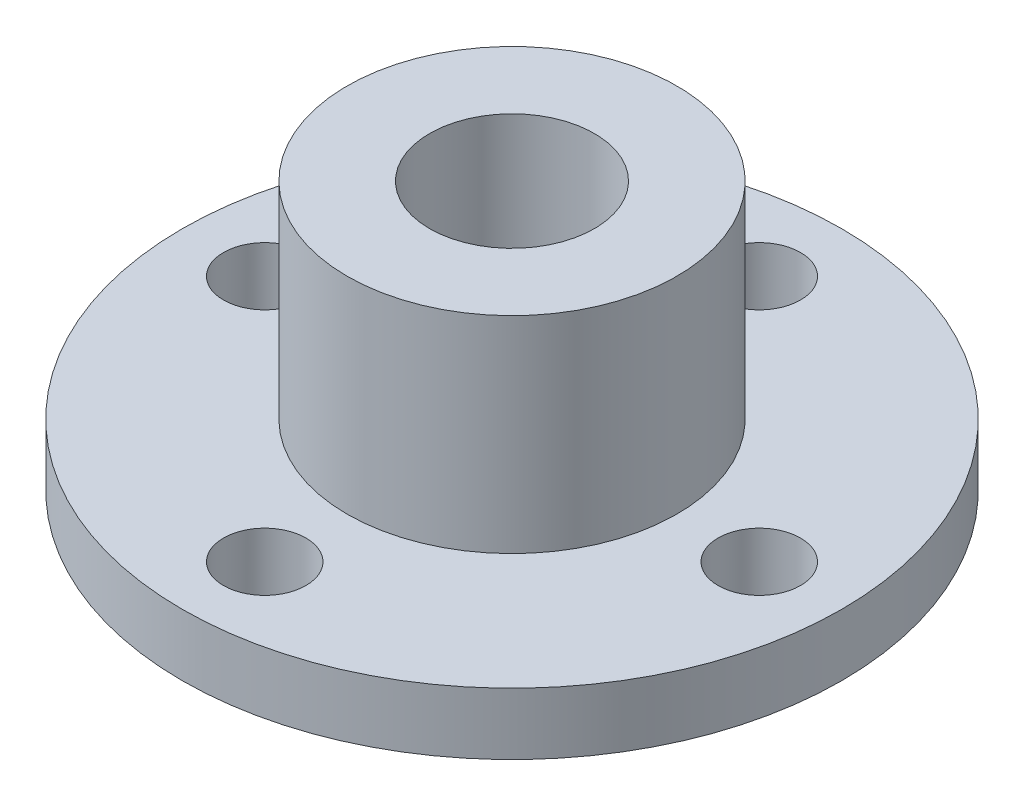
ISO-10303-21;
HEADER;
FILE_DESCRIPTION(('STEP AP214'),'2;1');
FILE_NAME('part.step','',(''),(''),'','','');
FILE_SCHEMA(('AUTOMOTIVE_DESIGN { 1 0 10303 214 1 1 1 1 }'));
ENDSEC;
DATA;
#1=APPLICATION_CONTEXT('core data for automotive mechanical design processes');
#2=APPLICATION_PROTOCOL_DEFINITION('international standard','automotive_design',2000,#1);
#3=PRODUCT_CONTEXT('',#1,'mechanical');
#4=PRODUCT('Part','Part','',(#3));
#5=PRODUCT_RELATED_PRODUCT_CATEGORY('part','',(#4));
#6=PRODUCT_DEFINITION_FORMATION('','',#4);
#7=PRODUCT_DEFINITION_CONTEXT('part definition',#1,'design');
#8=PRODUCT_DEFINITION('design','',#6,#7);
#9=PRODUCT_DEFINITION_SHAPE('','',#8);
#10=(LENGTH_UNIT() NAMED_UNIT(*) SI_UNIT(.MILLI.,.METRE.));
#11=(NAMED_UNIT(*) PLANE_ANGLE_UNIT() SI_UNIT($,.RADIAN.));
#12=(NAMED_UNIT(*) SI_UNIT($,.STERADIAN.) SOLID_ANGLE_UNIT());
#13=UNCERTAINTY_MEASURE_WITH_UNIT(LENGTH_MEASURE(1.E-05),#10,'distance_accuracy_value','');
#14=(GEOMETRIC_REPRESENTATION_CONTEXT(3) GLOBAL_UNCERTAINTY_ASSIGNED_CONTEXT((#13)) GLOBAL_UNIT_ASSIGNED_CONTEXT((#10,
#11,#12)) REPRESENTATION_CONTEXT('',''));
#15=CARTESIAN_POINT('',(0.,0.,0.));
#16=DIRECTION('',(0.,0.,1.));
#17=DIRECTION('',(1.,0.,0.));
#18=AXIS2_PLACEMENT_3D('',#15,#16,#17);
#19=CARTESIAN_POINT('',(0.,3.,0.));
#20=DIRECTION('',(0.,-1.,0.));
#21=DIRECTION('',(0.,0.,-1.));
#22=AXIS2_PLACEMENT_3D('',#19,#20,#21);
#23=CYLINDRICAL_SURFACE('',#22,16.);
#24=CARTESIAN_POINT('',(0.,3.,0.));
#25=DIRECTION('',(0.,1.,0.));
#26=DIRECTION('',(0.,0.,1.));
#27=AXIS2_PLACEMENT_3D('',#24,#25,#26);
#28=CIRCLE('',#27,16.);
#29=CARTESIAN_POINT('',(0.,3.,16.));
#30=VERTEX_POINT('',#29);
#31=EDGE_CURVE('E47',#30,#30,#28,.T.);
#32=ORIENTED_EDGE('',*,*,#31,.F.);
#33=EDGE_LOOP('',(#32));
#34=FACE_BOUND('',#33,.T.);
#35=CARTESIAN_POINT('',(0.,0.,0.));
#36=DIRECTION('',(0.,1.,0.));
#37=DIRECTION('',(0.,0.,1.));
#38=AXIS2_PLACEMENT_3D('',#35,#36,#37);
#39=CIRCLE('',#38,16.);
#40=CARTESIAN_POINT('',(0.,0.,16.));
#41=VERTEX_POINT('',#40);
#42=EDGE_CURVE('E42',#41,#41,#39,.T.);
#43=ORIENTED_EDGE('',*,*,#42,.T.);
#44=EDGE_LOOP('',(#43));
#45=FACE_BOUND('',#44,.T.);
#46=ADVANCED_FACE('F39',(#34,#45),#23,.T.);
#47=CARTESIAN_POINT('',(0.,3.,0.));
#48=DIRECTION('',(0.,1.,0.));
#49=DIRECTION('',(0.,0.,1.));
#50=AXIS2_PLACEMENT_3D('',#47,#48,#49);
#51=PLANE('',#50);
#52=CARTESIAN_POINT('',(-12.,3.,0.));
#53=DIRECTION('',(0.,1.,0.));
#54=DIRECTION('',(0.,0.,1.));
#55=AXIS2_PLACEMENT_3D('',#52,#53,#54);
#56=CIRCLE('',#55,2.);
#57=CARTESIAN_POINT('',(-12.,3.,2.));
#58=VERTEX_POINT('',#57);
#59=EDGE_CURVE('E66',#58,#58,#56,.F.);
#60=ORIENTED_EDGE('',*,*,#59,.T.);
#61=EDGE_LOOP('',(#60));
#62=FACE_BOUND('',#61,.T.);
#63=CARTESIAN_POINT('',(0.,3.,12.));
#64=DIRECTION('',(0.,1.,0.));
#65=DIRECTION('',(0.,0.,1.));
#66=AXIS2_PLACEMENT_3D('',#63,#64,#65);
#67=CIRCLE('',#66,2.);
#68=CARTESIAN_POINT('',(0.,3.,14.));
#69=VERTEX_POINT('',#68);
#70=EDGE_CURVE('E80',#69,#69,#67,.F.);
#71=ORIENTED_EDGE('',*,*,#70,.T.);
#72=EDGE_LOOP('',(#71));
#73=FACE_BOUND('',#72,.T.);
#74=CARTESIAN_POINT('',(12.,3.,0.));
#75=DIRECTION('',(0.,1.,0.));
#76=DIRECTION('',(0.,0.,1.));
#77=AXIS2_PLACEMENT_3D('',#74,#75,#76);
#78=CIRCLE('',#77,2.);
#79=CARTESIAN_POINT('',(12.,3.,2.));
#80=VERTEX_POINT('',#79);
#81=EDGE_CURVE('E71',#80,#80,#78,.F.);
#82=ORIENTED_EDGE('',*,*,#81,.T.);
#83=EDGE_LOOP('',(#82));
#84=FACE_BOUND('',#83,.T.);
#85=CARTESIAN_POINT('',(0.,3.,-12.));
#86=DIRECTION('',(0.,1.,0.));
#87=DIRECTION('',(0.,0.,1.));
#88=AXIS2_PLACEMENT_3D('',#85,#86,#87);
#89=CIRCLE('',#88,2.);
#90=CARTESIAN_POINT('',(0.,3.,-10.));
#91=VERTEX_POINT('',#90);
#92=EDGE_CURVE('E72',#91,#91,#89,.F.);
#93=ORIENTED_EDGE('',*,*,#92,.T.);
#94=EDGE_LOOP('',(#93));
#95=FACE_BOUND('',#94,.T.);
#96=CARTESIAN_POINT('',(0.,3.,0.));
#97=DIRECTION('',(0.,1.,0.));
#98=DIRECTION('',(0.,0.,1.));
#99=AXIS2_PLACEMENT_3D('',#96,#97,#98);
#100=CIRCLE('',#99,8.);
#101=CARTESIAN_POINT('',(0.,3.,8.));
#102=VERTEX_POINT('',#101);
#103=EDGE_CURVE('E10',#102,#102,#100,.T.);
#104=ORIENTED_EDGE('',*,*,#103,.F.);
#105=EDGE_LOOP('',(#104));
#106=FACE_BOUND('',#105,.T.);
#107=ORIENTED_EDGE('',*,*,#31,.T.);
#108=EDGE_LOOP('',(#107));
#109=FACE_BOUND('',#108,.T.);
#110=ADVANCED_FACE('F106',(#62,#73,#84,#95,#106,#109),#51,.T.);
#111=CARTESIAN_POINT('',(0.,0.,0.));
#112=DIRECTION('',(0.,1.,0.));
#113=DIRECTION('',(0.,0.,1.));
#114=AXIS2_PLACEMENT_3D('',#111,#112,#113);
#115=PLANE('',#114);
#116=CARTESIAN_POINT('',(-12.,0.,0.));
#117=DIRECTION('',(0.,-1.,0.));
#118=DIRECTION('',(0.,0.,-1.));
#119=AXIS2_PLACEMENT_3D('',#116,#117,#118);
#120=CIRCLE('',#119,2.);
#121=CARTESIAN_POINT('',(-12.,0.,-2.));
#122=VERTEX_POINT('',#121);
#123=EDGE_CURVE('E88',#122,#122,#120,.T.);
#124=ORIENTED_EDGE('',*,*,#123,.F.);
#125=EDGE_LOOP('',(#124));
#126=FACE_BOUND('',#125,.T.);
#127=CARTESIAN_POINT('',(0.,0.,12.));
#128=DIRECTION('',(0.,-1.,0.));
#129=DIRECTION('',(0.,0.,-1.));
#130=AXIS2_PLACEMENT_3D('',#127,#128,#129);
#131=CIRCLE('',#130,2.);
#132=CARTESIAN_POINT('',(0.,0.,10.));
#133=VERTEX_POINT('',#132);
#134=EDGE_CURVE('E84',#133,#133,#131,.T.);
#135=ORIENTED_EDGE('',*,*,#134,.F.);
#136=EDGE_LOOP('',(#135));
#137=FACE_BOUND('',#136,.T.);
#138=CARTESIAN_POINT('',(12.,0.,0.));
#139=DIRECTION('',(0.,-1.,0.));
#140=DIRECTION('',(0.,0.,-1.));
#141=AXIS2_PLACEMENT_3D('',#138,#139,#140);
#142=CIRCLE('',#141,2.);
#143=CARTESIAN_POINT('',(12.,0.,-2.));
#144=VERTEX_POINT('',#143);
#145=EDGE_CURVE('E76',#144,#144,#142,.T.);
#146=ORIENTED_EDGE('',*,*,#145,.F.);
#147=EDGE_LOOP('',(#146));
#148=FACE_BOUND('',#147,.T.);
#149=CARTESIAN_POINT('',(0.,0.,-12.));
#150=DIRECTION('',(0.,-1.,0.));
#151=DIRECTION('',(0.,0.,-1.));
#152=AXIS2_PLACEMENT_3D('',#149,#150,#151);
#153=CIRCLE('',#152,2.);
#154=CARTESIAN_POINT('',(0.,0.,-14.));
#155=VERTEX_POINT('',#154);
#156=EDGE_CURVE('E67',#155,#155,#153,.T.);
#157=ORIENTED_EDGE('',*,*,#156,.F.);
#158=EDGE_LOOP('',(#157));
#159=FACE_BOUND('',#158,.T.);
#160=CARTESIAN_POINT('',(0.,0.,0.));
#161=DIRECTION('',(0.,1.,0.));
#162=DIRECTION('',(0.,0.,1.));
#163=AXIS2_PLACEMENT_3D('',#160,#161,#162);
#164=CIRCLE('',#163,4.);
#165=CARTESIAN_POINT('',(0.,0.,4.));
#166=VERTEX_POINT('',#165);
#167=EDGE_CURVE('E58',#166,#166,#164,.F.);
#168=ORIENTED_EDGE('',*,*,#167,.F.);
#169=EDGE_LOOP('',(#168));
#170=FACE_BOUND('',#169,.T.);
#171=ORIENTED_EDGE('',*,*,#42,.F.);
#172=EDGE_LOOP('',(#171));
#173=FACE_BOUND('',#172,.T.);
#174=ADVANCED_FACE('F102',(#126,#137,#148,#159,#170,#173),#115,.F.);
#175=CARTESIAN_POINT('',(0.,13.,0.));
#176=DIRECTION('',(0.,-1.,0.));
#177=DIRECTION('',(0.,0.,-1.));
#178=AXIS2_PLACEMENT_3D('',#175,#176,#177);
#179=CYLINDRICAL_SURFACE('',#178,8.);
#180=CARTESIAN_POINT('',(0.,13.,0.));
#181=DIRECTION('',(0.,1.,0.));
#182=DIRECTION('',(0.,0.,1.));
#183=AXIS2_PLACEMENT_3D('',#180,#181,#182);
#184=CIRCLE('',#183,8.);
#185=CARTESIAN_POINT('',(0.,13.,8.));
#186=VERTEX_POINT('',#185);
#187=EDGE_CURVE('E54',#186,#186,#184,.T.);
#188=ORIENTED_EDGE('',*,*,#187,.F.);
#189=EDGE_LOOP('',(#188));
#190=FACE_BOUND('',#189,.T.);
#191=ORIENTED_EDGE('',*,*,#103,.T.);
#192=EDGE_LOOP('',(#191));
#193=FACE_BOUND('',#192,.T.);
#194=ADVANCED_FACE('F105',(#190,#193),#179,.T.);
#195=CARTESIAN_POINT('',(0.,13.,0.));
#196=DIRECTION('',(0.,1.,0.));
#197=DIRECTION('',(0.,0.,1.));
#198=AXIS2_PLACEMENT_3D('',#195,#196,#197);
#199=PLANE('',#198);
#200=CARTESIAN_POINT('',(0.,13.,0.));
#201=DIRECTION('',(0.,1.,0.));
#202=DIRECTION('',(0.,0.,1.));
#203=AXIS2_PLACEMENT_3D('',#200,#201,#202);
#204=CIRCLE('',#203,4.);
#205=CARTESIAN_POINT('',(0.,13.,4.));
#206=VERTEX_POINT('',#205);
#207=EDGE_CURVE('E62',#206,#206,#204,.T.);
#208=ORIENTED_EDGE('',*,*,#207,.F.);
#209=EDGE_LOOP('',(#208));
#210=FACE_BOUND('',#209,.T.);
#211=ORIENTED_EDGE('',*,*,#187,.T.);
#212=EDGE_LOOP('',(#211));
#213=FACE_BOUND('',#212,.T.);
#214=ADVANCED_FACE('F134',(#210,#213),#199,.T.);
#215=CARTESIAN_POINT('',(0.,-11.3137084989848,0.));
#216=DIRECTION('',(0.,1.,0.));
#217=DIRECTION('',(0.,0.,1.));
#218=AXIS2_PLACEMENT_3D('',#215,#216,#217);
#219=CYLINDRICAL_SURFACE('',#218,4.);
#220=ORIENTED_EDGE('',*,*,#167,.T.);
#221=EDGE_LOOP('',(#220));
#222=FACE_BOUND('',#221,.T.);
#223=ORIENTED_EDGE('',*,*,#207,.T.);
#224=EDGE_LOOP('',(#223));
#225=FACE_BOUND('',#224,.T.);
#226=ADVANCED_FACE('F138',(#222,#225),#219,.F.);
#227=CARTESIAN_POINT('',(0.,8.65685424949238,-12.));
#228=DIRECTION('',(0.,-1.,0.));
#229=DIRECTION('',(0.,0.,-1.));
#230=AXIS2_PLACEMENT_3D('',#227,#228,#229);
#231=CYLINDRICAL_SURFACE('',#230,2.);
#232=ORIENTED_EDGE('',*,*,#156,.T.);
#233=EDGE_LOOP('',(#232));
#234=FACE_BOUND('',#233,.T.);
#235=ORIENTED_EDGE('',*,*,#92,.F.);
#236=EDGE_LOOP('',(#235));
#237=FACE_BOUND('',#236,.T.);
#238=ADVANCED_FACE('F142',(#234,#237),#231,.F.);
#239=CARTESIAN_POINT('',(12.,8.65685424949238,0.));
#240=DIRECTION('',(0.,-1.,0.));
#241=DIRECTION('',(0.,0.,-1.));
#242=AXIS2_PLACEMENT_3D('',#239,#240,#241);
#243=CYLINDRICAL_SURFACE('',#242,2.);
#244=ORIENTED_EDGE('',*,*,#145,.T.);
#245=EDGE_LOOP('',(#244));
#246=FACE_BOUND('',#245,.T.);
#247=ORIENTED_EDGE('',*,*,#81,.F.);
#248=EDGE_LOOP('',(#247));
#249=FACE_BOUND('',#248,.T.);
#250=ADVANCED_FACE('F146',(#246,#249),#243,.F.);
#251=CARTESIAN_POINT('',(0.,8.65685424949238,12.));
#252=DIRECTION('',(0.,-1.,0.));
#253=DIRECTION('',(0.,0.,-1.));
#254=AXIS2_PLACEMENT_3D('',#251,#252,#253);
#255=CYLINDRICAL_SURFACE('',#254,2.);
#256=ORIENTED_EDGE('',*,*,#134,.T.);
#257=EDGE_LOOP('',(#256));
#258=FACE_BOUND('',#257,.T.);
#259=ORIENTED_EDGE('',*,*,#70,.F.);
#260=EDGE_LOOP('',(#259));
#261=FACE_BOUND('',#260,.T.);
#262=ADVANCED_FACE('F150',(#258,#261),#255,.F.);
#263=CARTESIAN_POINT('',(-12.,8.65685424949238,0.));
#264=DIRECTION('',(0.,-1.,0.));
#265=DIRECTION('',(0.,0.,-1.));
#266=AXIS2_PLACEMENT_3D('',#263,#264,#265);
#267=CYLINDRICAL_SURFACE('',#266,2.);
#268=ORIENTED_EDGE('',*,*,#123,.T.);
#269=EDGE_LOOP('',(#268));
#270=FACE_BOUND('',#269,.T.);
#271=ORIENTED_EDGE('',*,*,#59,.F.);
#272=EDGE_LOOP('',(#271));
#273=FACE_BOUND('',#272,.T.);
#274=ADVANCED_FACE('F99',(#270,#273),#267,.F.);
#275=CLOSED_SHELL('',(#46,#110,#174,#194,#214,#226,#238,#250,#262,#274));
#276=MANIFOLD_SOLID_BREP('B2',#275);
#277=ADVANCED_BREP_SHAPE_REPRESENTATION('',(#18,#276),#14);
#278=SHAPE_DEFINITION_REPRESENTATION(#9,#277);
ENDSEC;
END-ISO-10303-21;
